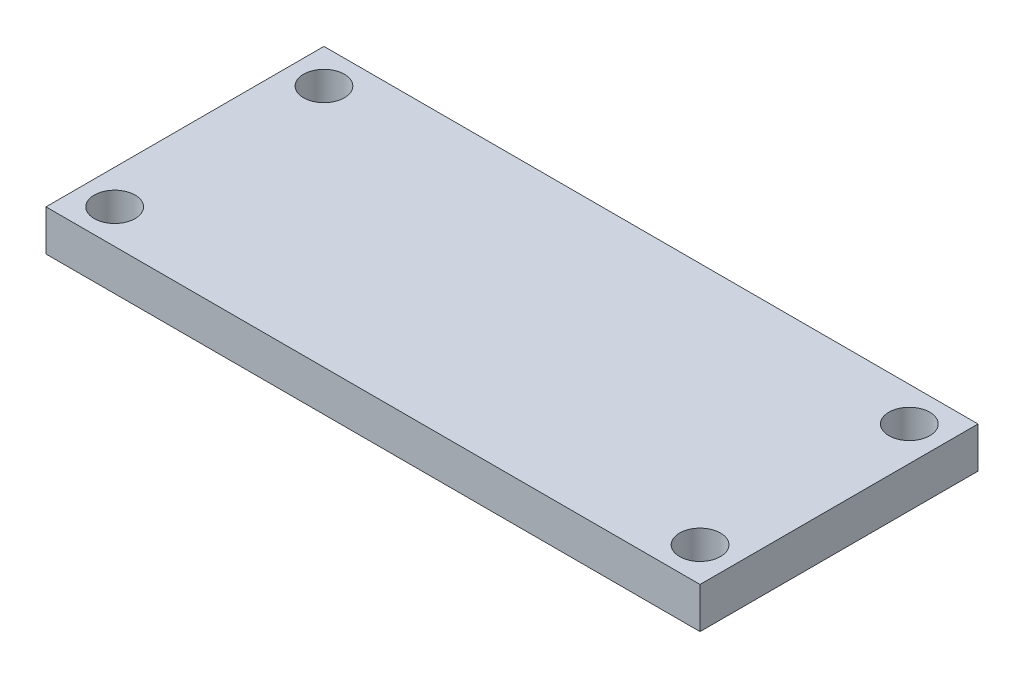
ISO-10303-21;
HEADER;
FILE_DESCRIPTION(('STEP AP214'),'2;1');
FILE_NAME('part.step','',(''),(''),'','','');
FILE_SCHEMA(('AUTOMOTIVE_DESIGN { 1 0 10303 214 1 1 1 1 }'));
ENDSEC;
DATA;
#1=APPLICATION_CONTEXT('core data for automotive mechanical design processes');
#2=APPLICATION_PROTOCOL_DEFINITION('international standard','automotive_design',2000,#1);
#3=PRODUCT_CONTEXT('',#1,'mechanical');
#4=PRODUCT('Part','Part','',(#3));
#5=PRODUCT_RELATED_PRODUCT_CATEGORY('part','',(#4));
#6=PRODUCT_DEFINITION_FORMATION('','',#4);
#7=PRODUCT_DEFINITION_CONTEXT('part definition',#1,'design');
#8=PRODUCT_DEFINITION('design','',#6,#7);
#9=PRODUCT_DEFINITION_SHAPE('','',#8);
#10=(LENGTH_UNIT() NAMED_UNIT(*) SI_UNIT(.MILLI.,.METRE.));
#11=(NAMED_UNIT(*) PLANE_ANGLE_UNIT() SI_UNIT($,.RADIAN.));
#12=(NAMED_UNIT(*) SI_UNIT($,.STERADIAN.) SOLID_ANGLE_UNIT());
#13=UNCERTAINTY_MEASURE_WITH_UNIT(LENGTH_MEASURE(1.E-05),#10,'distance_accuracy_value','');
#14=(GEOMETRIC_REPRESENTATION_CONTEXT(3) GLOBAL_UNCERTAINTY_ASSIGNED_CONTEXT((#13)) GLOBAL_UNIT_ASSIGNED_CONTEXT((#10,
#11,#12)) REPRESENTATION_CONTEXT('',''));
#15=CARTESIAN_POINT('',(0.,0.,0.));
#16=DIRECTION('',(0.,0.,1.));
#17=DIRECTION('',(1.,0.,0.));
#18=AXIS2_PLACEMENT_3D('',#15,#16,#17);
#19=CARTESIAN_POINT('',(0.,2.5,8.5));
#20=DIRECTION('',(0.,0.,-1.));
#21=DIRECTION('',(-1.,0.,0.));
#22=AXIS2_PLACEMENT_3D('',#19,#20,#21);
#23=PLANE('',#22);
#24=DIRECTION('',(1.,0.,0.));
#25=VECTOR('',#24,1.);
#26=CARTESIAN_POINT('',(0.,0.,8.5));
#27=LINE('',#26,#25);
#28=CARTESIAN_POINT('',(-20.,0.,8.5));
#29=VERTEX_POINT('',#28);
#30=CARTESIAN_POINT('',(20.,0.,8.5));
#31=VERTEX_POINT('',#30);
#32=EDGE_CURVE('E109',#29,#31,#27,.T.);
#33=ORIENTED_EDGE('',*,*,#32,.T.);
#34=DIRECTION('',(0.,-1.,0.));
#35=VECTOR('',#34,1.);
#36=CARTESIAN_POINT('',(20.,2.5,8.5));
#37=LINE('',#36,#35);
#38=CARTESIAN_POINT('',(20.,2.5,8.5));
#39=VERTEX_POINT('',#38);
#40=EDGE_CURVE('E11',#39,#31,#37,.T.);
#41=ORIENTED_EDGE('',*,*,#40,.F.);
#42=DIRECTION('',(1.,0.,0.));
#43=VECTOR('',#42,1.);
#44=CARTESIAN_POINT('',(0.,2.5,8.5));
#45=LINE('',#44,#43);
#46=CARTESIAN_POINT('',(-20.,2.5,8.5));
#47=VERTEX_POINT('',#46);
#48=EDGE_CURVE('E83',#47,#39,#45,.T.);
#49=ORIENTED_EDGE('',*,*,#48,.F.);
#50=DIRECTION('',(0.,-1.,0.));
#51=VECTOR('',#50,1.);
#52=CARTESIAN_POINT('',(-20.,2.5,8.5));
#53=LINE('',#52,#51);
#54=EDGE_CURVE('E49',#47,#29,#53,.T.);
#55=ORIENTED_EDGE('',*,*,#54,.T.);
#56=EDGE_LOOP('',(#33,#41,#49,#55));
#57=FACE_BOUND('',#56,.T.);
#58=ADVANCED_FACE('F33',(#57),#23,.F.);
#59=CARTESIAN_POINT('',(20.,2.5,0.));
#60=DIRECTION('',(-1.,0.,0.));
#61=DIRECTION('',(0.,0.,1.));
#62=AXIS2_PLACEMENT_3D('',#59,#60,#61);
#63=PLANE('',#62);
#64=DIRECTION('',(0.,0.,-1.));
#65=VECTOR('',#64,1.);
#66=CARTESIAN_POINT('',(20.,0.,0.));
#67=LINE('',#66,#65);
#68=CARTESIAN_POINT('',(20.,0.,-8.5));
#69=VERTEX_POINT('',#68);
#70=EDGE_CURVE('E88',#31,#69,#67,.T.);
#71=ORIENTED_EDGE('',*,*,#70,.T.);
#72=DIRECTION('',(0.,-1.,0.));
#73=VECTOR('',#72,1.);
#74=CARTESIAN_POINT('',(20.,2.5,-8.5));
#75=LINE('',#74,#73);
#76=CARTESIAN_POINT('',(20.,2.5,-8.5));
#77=VERTEX_POINT('',#76);
#78=EDGE_CURVE('E41',#77,#69,#75,.T.);
#79=ORIENTED_EDGE('',*,*,#78,.F.);
#80=DIRECTION('',(0.,0.,-1.));
#81=VECTOR('',#80,1.);
#82=CARTESIAN_POINT('',(20.,2.5,0.));
#83=LINE('',#82,#81);
#84=EDGE_CURVE('E74',#39,#77,#83,.T.);
#85=ORIENTED_EDGE('',*,*,#84,.F.);
#86=ORIENTED_EDGE('',*,*,#40,.T.);
#87=EDGE_LOOP('',(#71,#79,#85,#86));
#88=FACE_BOUND('',#87,.T.);
#89=ADVANCED_FACE('F87',(#88),#63,.F.);
#90=CARTESIAN_POINT('',(0.,2.5,-8.5));
#91=DIRECTION('',(0.,0.,-1.));
#92=DIRECTION('',(-1.,0.,0.));
#93=AXIS2_PLACEMENT_3D('',#90,#91,#92);
#94=PLANE('',#93);
#95=DIRECTION('',(1.,0.,0.));
#96=VECTOR('',#95,1.);
#97=CARTESIAN_POINT('',(0.,0.,-8.5));
#98=LINE('',#97,#96);
#99=CARTESIAN_POINT('',(-20.,0.,-8.5));
#100=VERTEX_POINT('',#99);
#101=EDGE_CURVE('E112',#100,#69,#98,.T.);
#102=ORIENTED_EDGE('',*,*,#101,.F.);
#103=DIRECTION('',(0.,-1.,0.));
#104=VECTOR('',#103,1.);
#105=CARTESIAN_POINT('',(-20.,2.5,-8.5));
#106=LINE('',#105,#104);
#107=CARTESIAN_POINT('',(-20.,2.5,-8.5));
#108=VERTEX_POINT('',#107);
#109=EDGE_CURVE('E63',#108,#100,#106,.T.);
#110=ORIENTED_EDGE('',*,*,#109,.F.);
#111=DIRECTION('',(1.,0.,0.));
#112=VECTOR('',#111,1.);
#113=CARTESIAN_POINT('',(0.,2.5,-8.5));
#114=LINE('',#113,#112);
#115=EDGE_CURVE('E82',#108,#77,#114,.T.);
#116=ORIENTED_EDGE('',*,*,#115,.T.);
#117=ORIENTED_EDGE('',*,*,#78,.T.);
#118=EDGE_LOOP('',(#102,#110,#116,#117));
#119=FACE_BOUND('',#118,.T.);
#120=ADVANCED_FACE('F91',(#119),#94,.T.);
#121=CARTESIAN_POINT('',(17.9,2.5,6.4));
#122=DIRECTION('',(0.,-1.,0.));
#123=DIRECTION('',(0.,0.,-1.));
#124=AXIS2_PLACEMENT_3D('',#121,#122,#123);
#125=CYLINDRICAL_SURFACE('',#124,1.25);
#126=CARTESIAN_POINT('',(17.9,2.5,6.4));
#127=DIRECTION('',(0.,1.,0.));
#128=DIRECTION('',(0.,0.,1.));
#129=AXIS2_PLACEMENT_3D('',#126,#127,#128);
#130=CIRCLE('',#129,1.25);
#131=CARTESIAN_POINT('',(17.9,2.5,7.65));
#132=VERTEX_POINT('',#131);
#133=EDGE_CURVE('E103',#132,#132,#130,.T.);
#134=ORIENTED_EDGE('',*,*,#133,.T.);
#135=EDGE_LOOP('',(#134));
#136=FACE_BOUND('',#135,.T.);
#137=CARTESIAN_POINT('',(17.9,0.,6.4));
#138=DIRECTION('',(0.,1.,0.));
#139=DIRECTION('',(0.,0.,1.));
#140=AXIS2_PLACEMENT_3D('',#137,#138,#139);
#141=CIRCLE('',#140,1.25);
#142=CARTESIAN_POINT('',(17.9,0.,7.65));
#143=VERTEX_POINT('',#142);
#144=EDGE_CURVE('E123',#143,#143,#141,.T.);
#145=ORIENTED_EDGE('',*,*,#144,.F.);
#146=EDGE_LOOP('',(#145));
#147=FACE_BOUND('',#146,.T.);
#148=ADVANCED_FACE('F163',(#136,#147),#125,.F.);
#149=CARTESIAN_POINT('',(-17.9,2.5,6.4));
#150=DIRECTION('',(0.,-1.,0.));
#151=DIRECTION('',(0.,0.,-1.));
#152=AXIS2_PLACEMENT_3D('',#149,#150,#151);
#153=CYLINDRICAL_SURFACE('',#152,1.25);
#154=CARTESIAN_POINT('',(-17.9,2.5,6.4));
#155=DIRECTION('',(0.,1.,0.));
#156=DIRECTION('',(0.,0.,1.));
#157=AXIS2_PLACEMENT_3D('',#154,#155,#156);
#158=CIRCLE('',#157,1.25);
#159=CARTESIAN_POINT('',(-17.9,2.5,7.65));
#160=VERTEX_POINT('',#159);
#161=EDGE_CURVE('E100',#160,#160,#158,.F.);
#162=ORIENTED_EDGE('',*,*,#161,.F.);
#163=EDGE_LOOP('',(#162));
#164=FACE_BOUND('',#163,.T.);
#165=CARTESIAN_POINT('',(-17.9,0.,6.4));
#166=DIRECTION('',(0.,1.,0.));
#167=DIRECTION('',(0.,0.,1.));
#168=AXIS2_PLACEMENT_3D('',#165,#166,#167);
#169=CIRCLE('',#168,1.25);
#170=CARTESIAN_POINT('',(-17.9,0.,7.65));
#171=VERTEX_POINT('',#170);
#172=EDGE_CURVE('E120',#171,#171,#169,.F.);
#173=ORIENTED_EDGE('',*,*,#172,.T.);
#174=EDGE_LOOP('',(#173));
#175=FACE_BOUND('',#174,.T.);
#176=ADVANCED_FACE('F157',(#164,#175),#153,.F.);
#177=CARTESIAN_POINT('',(-17.9,2.5,-6.4));
#178=DIRECTION('',(0.,-1.,0.));
#179=DIRECTION('',(0.,0.,-1.));
#180=AXIS2_PLACEMENT_3D('',#177,#178,#179);
#181=CYLINDRICAL_SURFACE('',#180,1.25);
#182=CARTESIAN_POINT('',(-17.9,2.5,-6.4));
#183=DIRECTION('',(0.,1.,0.));
#184=DIRECTION('',(0.,0.,1.));
#185=AXIS2_PLACEMENT_3D('',#182,#183,#184);
#186=CIRCLE('',#185,1.25);
#187=CARTESIAN_POINT('',(-17.9,2.5,-5.15));
#188=VERTEX_POINT('',#187);
#189=EDGE_CURVE('E94',#188,#188,#186,.T.);
#190=ORIENTED_EDGE('',*,*,#189,.T.);
#191=EDGE_LOOP('',(#190));
#192=FACE_BOUND('',#191,.T.);
#193=CARTESIAN_POINT('',(-17.9,0.,-6.4));
#194=DIRECTION('',(0.,1.,0.));
#195=DIRECTION('',(0.,0.,1.));
#196=AXIS2_PLACEMENT_3D('',#193,#194,#195);
#197=CIRCLE('',#196,1.25);
#198=CARTESIAN_POINT('',(-17.9,0.,-5.15));
#199=VERTEX_POINT('',#198);
#200=EDGE_CURVE('E117',#199,#199,#197,.T.);
#201=ORIENTED_EDGE('',*,*,#200,.F.);
#202=EDGE_LOOP('',(#201));
#203=FACE_BOUND('',#202,.T.);
#204=ADVANCED_FACE('F150',(#192,#203),#181,.F.);
#205=CARTESIAN_POINT('',(-20.,2.5,0.));
#206=DIRECTION('',(-1.,0.,0.));
#207=DIRECTION('',(0.,0.,1.));
#208=AXIS2_PLACEMENT_3D('',#205,#206,#207);
#209=PLANE('',#208);
#210=DIRECTION('',(0.,0.,-1.));
#211=VECTOR('',#210,1.);
#212=CARTESIAN_POINT('',(-20.,0.,0.));
#213=LINE('',#212,#211);
#214=EDGE_CURVE('E114',#29,#100,#213,.T.);
#215=ORIENTED_EDGE('',*,*,#214,.F.);
#216=ORIENTED_EDGE('',*,*,#54,.F.);
#217=DIRECTION('',(0.,0.,-1.));
#218=VECTOR('',#217,1.);
#219=CARTESIAN_POINT('',(-20.,2.5,0.));
#220=LINE('',#219,#218);
#221=EDGE_CURVE('E92',#47,#108,#220,.T.);
#222=ORIENTED_EDGE('',*,*,#221,.T.);
#223=ORIENTED_EDGE('',*,*,#109,.T.);
#224=EDGE_LOOP('',(#215,#216,#222,#223));
#225=FACE_BOUND('',#224,.T.);
#226=ADVANCED_FACE('F148',(#225),#209,.T.);
#227=CARTESIAN_POINT('',(17.9,2.5,-6.4));
#228=DIRECTION('',(0.,-1.,0.));
#229=DIRECTION('',(0.,0.,-1.));
#230=AXIS2_PLACEMENT_3D('',#227,#228,#229);
#231=CYLINDRICAL_SURFACE('',#230,1.25);
#232=CARTESIAN_POINT('',(17.9,2.5,-6.4));
#233=DIRECTION('',(0.,1.,0.));
#234=DIRECTION('',(0.,0.,1.));
#235=AXIS2_PLACEMENT_3D('',#232,#233,#234);
#236=CIRCLE('',#235,1.25);
#237=CARTESIAN_POINT('',(17.9,2.5,-5.15));
#238=VERTEX_POINT('',#237);
#239=EDGE_CURVE('E106',#238,#238,#236,.F.);
#240=ORIENTED_EDGE('',*,*,#239,.F.);
#241=EDGE_LOOP('',(#240));
#242=FACE_BOUND('',#241,.T.);
#243=CARTESIAN_POINT('',(17.9,0.,-6.4));
#244=DIRECTION('',(0.,1.,0.));
#245=DIRECTION('',(0.,0.,1.));
#246=AXIS2_PLACEMENT_3D('',#243,#244,#245);
#247=CIRCLE('',#246,1.25);
#248=CARTESIAN_POINT('',(17.9,0.,-5.15));
#249=VERTEX_POINT('',#248);
#250=EDGE_CURVE('E126',#249,#249,#247,.F.);
#251=ORIENTED_EDGE('',*,*,#250,.T.);
#252=EDGE_LOOP('',(#251));
#253=FACE_BOUND('',#252,.T.);
#254=ADVANCED_FACE('F132',(#242,#253),#231,.F.);
#255=CARTESIAN_POINT('',(0.,2.5,0.));
#256=DIRECTION('',(0.,1.,0.));
#257=DIRECTION('',(0.,0.,1.));
#258=AXIS2_PLACEMENT_3D('',#255,#256,#257);
#259=PLANE('',#258);
#260=ORIENTED_EDGE('',*,*,#48,.T.);
#261=ORIENTED_EDGE('',*,*,#84,.T.);
#262=ORIENTED_EDGE('',*,*,#115,.F.);
#263=ORIENTED_EDGE('',*,*,#221,.F.);
#264=EDGE_LOOP('',(#260,#261,#262,#263));
#265=FACE_BOUND('',#264,.T.);
#266=ORIENTED_EDGE('',*,*,#189,.F.);
#267=EDGE_LOOP('',(#266));
#268=FACE_BOUND('',#267,.T.);
#269=ORIENTED_EDGE('',*,*,#161,.T.);
#270=EDGE_LOOP('',(#269));
#271=FACE_BOUND('',#270,.T.);
#272=ORIENTED_EDGE('',*,*,#133,.F.);
#273=EDGE_LOOP('',(#272));
#274=FACE_BOUND('',#273,.T.);
#275=ORIENTED_EDGE('',*,*,#239,.T.);
#276=EDGE_LOOP('',(#275));
#277=FACE_BOUND('',#276,.T.);
#278=ADVANCED_FACE('F78',(#265,#268,#271,#274,#277),#259,.T.);
#279=CARTESIAN_POINT('',(0.,0.,0.));
#280=DIRECTION('',(0.,1.,0.));
#281=DIRECTION('',(0.,0.,1.));
#282=AXIS2_PLACEMENT_3D('',#279,#280,#281);
#283=PLANE('',#282);
#284=ORIENTED_EDGE('',*,*,#32,.F.);
#285=ORIENTED_EDGE('',*,*,#214,.T.);
#286=ORIENTED_EDGE('',*,*,#101,.T.);
#287=ORIENTED_EDGE('',*,*,#70,.F.);
#288=EDGE_LOOP('',(#284,#285,#286,#287));
#289=FACE_BOUND('',#288,.T.);
#290=ORIENTED_EDGE('',*,*,#200,.T.);
#291=EDGE_LOOP('',(#290));
#292=FACE_BOUND('',#291,.T.);
#293=ORIENTED_EDGE('',*,*,#172,.F.);
#294=EDGE_LOOP('',(#293));
#295=FACE_BOUND('',#294,.T.);
#296=ORIENTED_EDGE('',*,*,#144,.T.);
#297=EDGE_LOOP('',(#296));
#298=FACE_BOUND('',#297,.T.);
#299=ORIENTED_EDGE('',*,*,#250,.F.);
#300=EDGE_LOOP('',(#299));
#301=FACE_BOUND('',#300,.T.);
#302=ADVANCED_FACE('F134',(#289,#292,#295,#298,#301),#283,.F.);
#303=CLOSED_SHELL('',(#58,#89,#120,#148,#176,#204,#226,#254,#278,#302));
#304=MANIFOLD_SOLID_BREP('B2',#303);
#305=ADVANCED_BREP_SHAPE_REPRESENTATION('',(#18,#304),#14);
#306=SHAPE_DEFINITION_REPRESENTATION(#9,#305);
ENDSEC;
END-ISO-10303-21;
